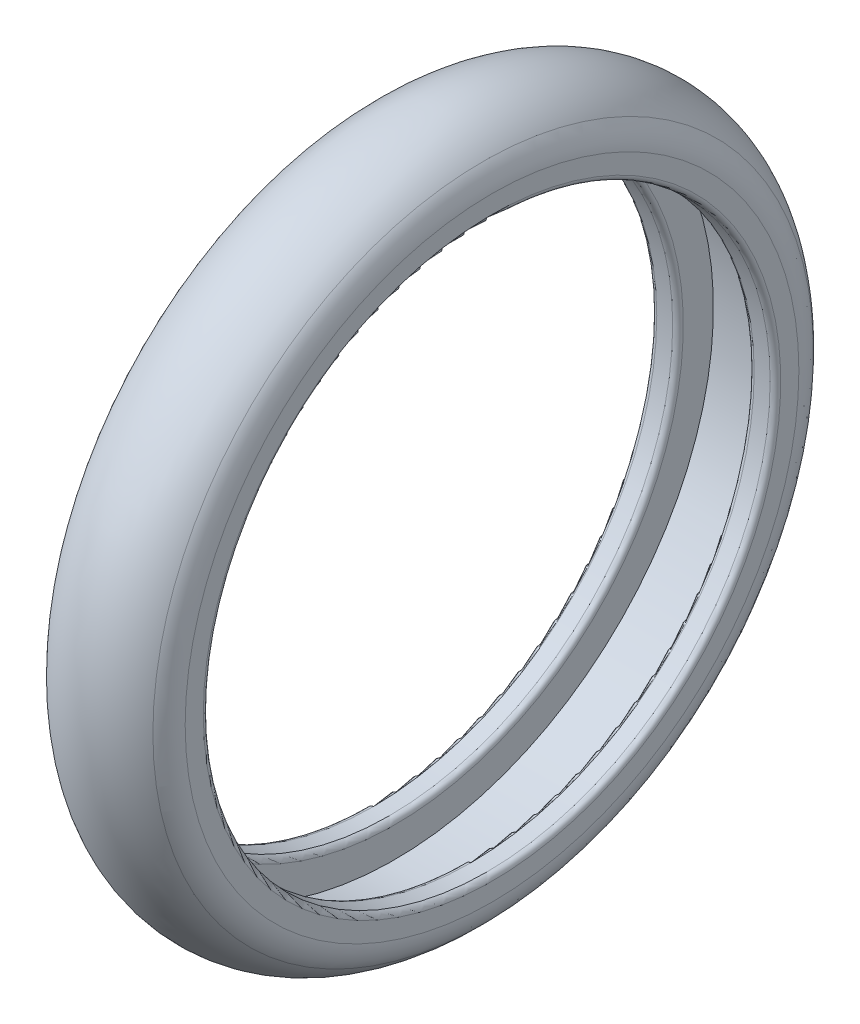
ISO-10303-21;
HEADER;
FILE_DESCRIPTION(('STEP AP214'),'2;1');
FILE_NAME('part.step','',(''),(''),'','','');
FILE_SCHEMA(('AUTOMOTIVE_DESIGN { 1 0 10303 214 1 1 1 1 }'));
ENDSEC;
DATA;
#1=APPLICATION_CONTEXT('core data for automotive mechanical design processes');
#2=APPLICATION_PROTOCOL_DEFINITION('international standard','automotive_design',2000,#1);
#3=PRODUCT_CONTEXT('',#1,'mechanical');
#4=PRODUCT('Part','Part','',(#3));
#5=PRODUCT_RELATED_PRODUCT_CATEGORY('part','',(#4));
#6=PRODUCT_DEFINITION_FORMATION('','',#4);
#7=PRODUCT_DEFINITION_CONTEXT('part definition',#1,'design');
#8=PRODUCT_DEFINITION('design','',#6,#7);
#9=PRODUCT_DEFINITION_SHAPE('','',#8);
#10=(LENGTH_UNIT() NAMED_UNIT(*) SI_UNIT(.MILLI.,.METRE.));
#11=(NAMED_UNIT(*) PLANE_ANGLE_UNIT() SI_UNIT($,.RADIAN.));
#12=(NAMED_UNIT(*) SI_UNIT($,.STERADIAN.) SOLID_ANGLE_UNIT());
#13=UNCERTAINTY_MEASURE_WITH_UNIT(LENGTH_MEASURE(1.E-05),#10,'distance_accuracy_value','');
#14=(GEOMETRIC_REPRESENTATION_CONTEXT(3) GLOBAL_UNCERTAINTY_ASSIGNED_CONTEXT((#13)) GLOBAL_UNIT_ASSIGNED_CONTEXT((#10,
#11,#12)) REPRESENTATION_CONTEXT('',''));
#15=CARTESIAN_POINT('',(0.,0.,0.));
#16=DIRECTION('',(0.,0.,1.));
#17=DIRECTION('',(1.,0.,0.));
#18=AXIS2_PLACEMENT_3D('',#15,#16,#17);
#19=CARTESIAN_POINT('',(0.,0.,0.));
#20=DIRECTION('',(-1.,0.,0.));
#21=DIRECTION('',(0.,0.,1.));
#22=AXIS2_PLACEMENT_3D('',#19,#20,#21);
#23=CYLINDRICAL_SURFACE('',#22,16.);
#24=CARTESIAN_POINT('',(2.3,0.,0.));
#25=DIRECTION('',(1.,0.,0.));
#26=DIRECTION('',(0.,0.,-1.));
#27=AXIS2_PLACEMENT_3D('',#24,#25,#26);
#28=CIRCLE('',#27,16.);
#29=CARTESIAN_POINT('',(2.3,0.,-16.));
#30=VERTEX_POINT('',#29);
#31=EDGE_CURVE('E64',#30,#30,#28,.F.);
#32=ORIENTED_EDGE('',*,*,#31,.T.);
#33=EDGE_LOOP('',(#32));
#34=FACE_BOUND('',#33,.T.);
#35=CARTESIAN_POINT('',(3.2,0.,0.));
#36=DIRECTION('',(-1.,0.,0.));
#37=DIRECTION('',(0.,0.,1.));
#38=AXIS2_PLACEMENT_3D('',#35,#36,#37);
#39=CIRCLE('',#38,16.);
#40=CARTESIAN_POINT('',(3.2,0.,16.));
#41=VERTEX_POINT('',#40);
#42=EDGE_CURVE('E67',#41,#41,#39,.F.);
#43=ORIENTED_EDGE('',*,*,#42,.T.);
#44=EDGE_LOOP('',(#43));
#45=FACE_BOUND('',#44,.T.);
#46=ADVANCED_FACE('F38',(#34,#45),#23,.F.);
#47=CARTESIAN_POINT('',(2.,18.,0.));
#48=DIRECTION('',(1.,0.,0.));
#49=DIRECTION('',(0.,0.,-1.));
#50=AXIS2_PLACEMENT_3D('',#47,#48,#49);
#51=PLANE('',#50);
#52=CARTESIAN_POINT('',(2.,0.,0.));
#53=DIRECTION('',(1.,0.,0.));
#54=DIRECTION('',(0.,0.,-1.));
#55=AXIS2_PLACEMENT_3D('',#52,#53,#54);
#56=CIRCLE('',#55,16.3);
#57=CARTESIAN_POINT('',(2.,0.,-16.3));
#58=VERTEX_POINT('',#57);
#59=EDGE_CURVE('E61',#58,#58,#56,.T.);
#60=ORIENTED_EDGE('',*,*,#59,.T.);
#61=EDGE_LOOP('',(#60));
#62=FACE_BOUND('',#61,.T.);
#63=CARTESIAN_POINT('',(2.,0.,0.));
#64=DIRECTION('',(-1.,0.,0.));
#65=DIRECTION('',(0.,0.,1.));
#66=AXIS2_PLACEMENT_3D('',#63,#64,#65);
#67=CIRCLE('',#66,18.);
#68=CARTESIAN_POINT('',(2.,0.,18.));
#69=VERTEX_POINT('',#68);
#70=EDGE_CURVE('E82',#69,#69,#67,.T.);
#71=ORIENTED_EDGE('',*,*,#70,.T.);
#72=EDGE_LOOP('',(#71));
#73=FACE_BOUND('',#72,.T.);
#74=ADVANCED_FACE('F103',(#62,#73),#51,.F.);
#75=CARTESIAN_POINT('',(0.,0.,0.));
#76=DIRECTION('',(-1.,0.,0.));
#77=DIRECTION('',(0.,0.,1.));
#78=AXIS2_PLACEMENT_3D('',#75,#76,#77);
#79=CYLINDRICAL_SURFACE('',#78,18.);
#80=ORIENTED_EDGE('',*,*,#70,.F.);
#81=EDGE_LOOP('',(#80));
#82=FACE_BOUND('',#81,.T.);
#83=CARTESIAN_POINT('',(-2.,0.,0.));
#84=DIRECTION('',(-1.,0.,0.));
#85=DIRECTION('',(0.,0.,1.));
#86=AXIS2_PLACEMENT_3D('',#83,#84,#85);
#87=CIRCLE('',#86,18.);
#88=CARTESIAN_POINT('',(-2.,0.,18.));
#89=VERTEX_POINT('',#88);
#90=EDGE_CURVE('E85',#89,#89,#87,.T.);
#91=ORIENTED_EDGE('',*,*,#90,.T.);
#92=EDGE_LOOP('',(#91));
#93=FACE_BOUND('',#92,.T.);
#94=ADVANCED_FACE('F89',(#82,#93),#79,.F.);
#95=CARTESIAN_POINT('',(-2.,18.,0.));
#96=DIRECTION('',(-1.,0.,0.));
#97=DIRECTION('',(0.,0.,1.));
#98=AXIS2_PLACEMENT_3D('',#95,#96,#97);
#99=PLANE('',#98);
#100=CARTESIAN_POINT('',(-2.,0.,0.));
#101=DIRECTION('',(-1.,0.,0.));
#102=DIRECTION('',(0.,0.,1.));
#103=AXIS2_PLACEMENT_3D('',#100,#101,#102);
#104=CIRCLE('',#103,16.3);
#105=CARTESIAN_POINT('',(-2.,0.,16.3));
#106=VERTEX_POINT('',#105);
#107=EDGE_CURVE('E58',#106,#106,#104,.T.);
#108=ORIENTED_EDGE('',*,*,#107,.T.);
#109=EDGE_LOOP('',(#108));
#110=FACE_BOUND('',#109,.T.);
#111=ORIENTED_EDGE('',*,*,#90,.F.);
#112=EDGE_LOOP('',(#111));
#113=FACE_BOUND('',#112,.T.);
#114=ADVANCED_FACE('F91',(#110,#113),#99,.F.);
#115=CARTESIAN_POINT('',(0.,0.,0.));
#116=DIRECTION('',(-1.,0.,0.));
#117=DIRECTION('',(0.,0.,1.));
#118=AXIS2_PLACEMENT_3D('',#115,#116,#117);
#119=CYLINDRICAL_SURFACE('',#118,16.);
#120=CARTESIAN_POINT('',(-2.3,0.,0.));
#121=DIRECTION('',(-1.,0.,0.));
#122=DIRECTION('',(0.,0.,1.));
#123=AXIS2_PLACEMENT_3D('',#120,#121,#122);
#124=CIRCLE('',#123,16.);
#125=CARTESIAN_POINT('',(-2.3,0.,16.));
#126=VERTEX_POINT('',#125);
#127=EDGE_CURVE('E49',#126,#126,#124,.F.);
#128=ORIENTED_EDGE('',*,*,#127,.T.);
#129=EDGE_LOOP('',(#128));
#130=FACE_BOUND('',#129,.T.);
#131=CARTESIAN_POINT('',(-3.2,0.,0.));
#132=DIRECTION('',(1.,0.,0.));
#133=DIRECTION('',(0.,0.,-1.));
#134=AXIS2_PLACEMENT_3D('',#131,#132,#133);
#135=CIRCLE('',#134,16.);
#136=CARTESIAN_POINT('',(-3.2,0.,-16.));
#137=VERTEX_POINT('',#136);
#138=EDGE_CURVE('E53',#137,#137,#135,.F.);
#139=ORIENTED_EDGE('',*,*,#138,.T.);
#140=EDGE_LOOP('',(#139));
#141=FACE_BOUND('',#140,.T.);
#142=ADVANCED_FACE('F93',(#130,#141),#119,.F.);
#143=CARTESIAN_POINT('',(-3.5,16.,0.));
#144=DIRECTION('',(1.,0.,0.));
#145=DIRECTION('',(0.,0.,-1.));
#146=AXIS2_PLACEMENT_3D('',#143,#144,#145);
#147=PLANE('',#146);
#148=CARTESIAN_POINT('',(-3.5,0.,0.));
#149=DIRECTION('',(1.,0.,0.));
#150=DIRECTION('',(0.,0.,-1.));
#151=AXIS2_PLACEMENT_3D('',#148,#149,#150);
#152=CIRCLE('',#151,16.3);
#153=CARTESIAN_POINT('',(-3.5,0.,-16.3));
#154=VERTEX_POINT('',#153);
#155=EDGE_CURVE('E45',#154,#154,#152,.T.);
#156=ORIENTED_EDGE('',*,*,#155,.T.);
#157=EDGE_LOOP('',(#156));
#158=FACE_BOUND('',#157,.T.);
#159=CARTESIAN_POINT('',(-3.5,0.,0.));
#160=DIRECTION('',(1.,0.,0.));
#161=DIRECTION('',(0.,0.,-1.));
#162=AXIS2_PLACEMENT_3D('',#159,#160,#161);
#163=CIRCLE('',#162,17.3228756555323);
#164=CARTESIAN_POINT('',(-3.5,0.,-17.3228756555323));
#165=VERTEX_POINT('',#164);
#166=EDGE_CURVE('E79',#165,#165,#163,.F.);
#167=ORIENTED_EDGE('',*,*,#166,.T.);
#168=EDGE_LOOP('',(#167));
#169=FACE_BOUND('',#168,.T.);
#170=ADVANCED_FACE('F100',(#158,#169),#147,.F.);
#171=CARTESIAN_POINT('',(0.,0.,0.));
#172=DIRECTION('',(-1.,0.,0.));
#173=DIRECTION('',(0.,0.,1.));
#174=AXIS2_PLACEMENT_3D('',#171,#172,#173);
#175=TOROIDAL_SURFACE('',#174,16.,4.);
#176=CARTESIAN_POINT('',(-3.00000000000004,0.,0.));
#177=DIRECTION('',(1.,0.,0.));
#178=DIRECTION('',(0.,0.,-1.));
#179=AXIS2_PLACEMENT_3D('',#176,#177,#178);
#180=CIRCLE('',#179,18.6457513110646);
#181=CARTESIAN_POINT('',(-3.00000000000004,0.,-18.6457513110646));
#182=VERTEX_POINT('',#181);
#183=EDGE_CURVE('E73',#182,#182,#180,.T.);
#184=ORIENTED_EDGE('',*,*,#183,.T.);
#185=EDGE_LOOP('',(#184));
#186=FACE_BOUND('',#185,.T.);
#187=CARTESIAN_POINT('',(3.00000000000004,0.,0.));
#188=DIRECTION('',(-1.,0.,0.));
#189=DIRECTION('',(0.,0.,1.));
#190=AXIS2_PLACEMENT_3D('',#187,#188,#189);
#191=CIRCLE('',#190,18.6457513110646);
#192=CARTESIAN_POINT('',(3.00000000000004,0.,18.6457513110646));
#193=VERTEX_POINT('',#192);
#194=EDGE_CURVE('E76',#193,#193,#191,.T.);
#195=ORIENTED_EDGE('',*,*,#194,.T.);
#196=EDGE_LOOP('',(#195));
#197=FACE_BOUND('',#196,.T.);
#198=ADVANCED_FACE('F172',(#186,#197),#175,.T.);
#199=CARTESIAN_POINT('',(3.5,16.,0.));
#200=DIRECTION('',(-1.,0.,0.));
#201=DIRECTION('',(0.,0.,1.));
#202=AXIS2_PLACEMENT_3D('',#199,#200,#201);
#203=PLANE('',#202);
#204=CARTESIAN_POINT('',(3.5,0.,0.));
#205=DIRECTION('',(-1.,0.,0.));
#206=DIRECTION('',(0.,0.,1.));
#207=AXIS2_PLACEMENT_3D('',#204,#205,#206);
#208=CIRCLE('',#207,16.3);
#209=CARTESIAN_POINT('',(3.5,0.,16.3));
#210=VERTEX_POINT('',#209);
#211=EDGE_CURVE('E11',#210,#210,#208,.T.);
#212=ORIENTED_EDGE('',*,*,#211,.T.);
#213=EDGE_LOOP('',(#212));
#214=FACE_BOUND('',#213,.T.);
#215=CARTESIAN_POINT('',(3.5,0.,0.));
#216=DIRECTION('',(-1.,0.,0.));
#217=DIRECTION('',(0.,0.,1.));
#218=AXIS2_PLACEMENT_3D('',#215,#216,#217);
#219=CIRCLE('',#218,17.3228756555323);
#220=CARTESIAN_POINT('',(3.5,0.,17.3228756555323));
#221=VERTEX_POINT('',#220);
#222=EDGE_CURVE('E70',#221,#221,#219,.F.);
#223=ORIENTED_EDGE('',*,*,#222,.T.);
#224=EDGE_LOOP('',(#223));
#225=FACE_BOUND('',#224,.T.);
#226=ADVANCED_FACE('F120',(#214,#225),#203,.F.);
#227=CARTESIAN_POINT('',(-1.5,0.,0.));
#228=DIRECTION('',(1.,0.,0.));
#229=DIRECTION('',(0.,0.,-1.));
#230=AXIS2_PLACEMENT_3D('',#227,#228,#229);
#231=TOROIDAL_SURFACE('',#230,17.3228756555323,2.);
#232=ORIENTED_EDGE('',*,*,#183,.F.);
#233=EDGE_LOOP('',(#232));
#234=FACE_BOUND('',#233,.T.);
#235=ORIENTED_EDGE('',*,*,#166,.F.);
#236=EDGE_LOOP('',(#235));
#237=FACE_BOUND('',#236,.T.);
#238=ADVANCED_FACE('F116',(#234,#237),#231,.T.);
#239=CARTESIAN_POINT('',(1.5,0.,0.));
#240=DIRECTION('',(-1.,0.,0.));
#241=DIRECTION('',(0.,0.,1.));
#242=AXIS2_PLACEMENT_3D('',#239,#240,#241);
#243=TOROIDAL_SURFACE('',#242,17.3228756555323,2.);
#244=ORIENTED_EDGE('',*,*,#222,.F.);
#245=EDGE_LOOP('',(#244));
#246=FACE_BOUND('',#245,.T.);
#247=ORIENTED_EDGE('',*,*,#194,.F.);
#248=EDGE_LOOP('',(#247));
#249=FACE_BOUND('',#248,.T.);
#250=ADVANCED_FACE('F119',(#246,#249),#243,.T.);
#251=CARTESIAN_POINT('',(2.3,0.,0.));
#252=DIRECTION('',(1.,0.,0.));
#253=DIRECTION('',(0.,0.,-1.));
#254=AXIS2_PLACEMENT_3D('',#251,#252,#253);
#255=TOROIDAL_SURFACE('',#254,16.3,0.3);
#256=ORIENTED_EDGE('',*,*,#59,.F.);
#257=EDGE_LOOP('',(#256));
#258=FACE_BOUND('',#257,.T.);
#259=ORIENTED_EDGE('',*,*,#31,.F.);
#260=EDGE_LOOP('',(#259));
#261=FACE_BOUND('',#260,.T.);
#262=ADVANCED_FACE('F124',(#258,#261),#255,.T.);
#263=CARTESIAN_POINT('',(-2.3,0.,0.));
#264=DIRECTION('',(-1.,0.,0.));
#265=DIRECTION('',(0.,0.,1.));
#266=AXIS2_PLACEMENT_3D('',#263,#264,#265);
#267=TOROIDAL_SURFACE('',#266,16.3,0.3);
#268=ORIENTED_EDGE('',*,*,#127,.F.);
#269=EDGE_LOOP('',(#268));
#270=FACE_BOUND('',#269,.T.);
#271=ORIENTED_EDGE('',*,*,#107,.F.);
#272=EDGE_LOOP('',(#271));
#273=FACE_BOUND('',#272,.T.);
#274=ADVANCED_FACE('F128',(#270,#273),#267,.T.);
#275=CARTESIAN_POINT('',(-3.2,0.,0.));
#276=DIRECTION('',(1.,0.,0.));
#277=DIRECTION('',(0.,0.,-1.));
#278=AXIS2_PLACEMENT_3D('',#275,#276,#277);
#279=TOROIDAL_SURFACE('',#278,16.3,0.3);
#280=ORIENTED_EDGE('',*,*,#155,.F.);
#281=EDGE_LOOP('',(#280));
#282=FACE_BOUND('',#281,.T.);
#283=ORIENTED_EDGE('',*,*,#138,.F.);
#284=EDGE_LOOP('',(#283));
#285=FACE_BOUND('',#284,.T.);
#286=ADVANCED_FACE('F131',(#282,#285),#279,.T.);
#287=CARTESIAN_POINT('',(3.2,0.,0.));
#288=DIRECTION('',(-1.,0.,0.));
#289=DIRECTION('',(0.,0.,1.));
#290=AXIS2_PLACEMENT_3D('',#287,#288,#289);
#291=TOROIDAL_SURFACE('',#290,16.3,0.3);
#292=ORIENTED_EDGE('',*,*,#42,.F.);
#293=EDGE_LOOP('',(#292));
#294=FACE_BOUND('',#293,.T.);
#295=ORIENTED_EDGE('',*,*,#211,.F.);
#296=EDGE_LOOP('',(#295));
#297=FACE_BOUND('',#296,.T.);
#298=ADVANCED_FACE('F40',(#294,#297),#291,.T.);
#299=CLOSED_SHELL('',(#46,#74,#94,#114,#142,#170,#198,#226,#238,#250,#262,#274,#286,#298));
#300=MANIFOLD_SOLID_BREP('B2',#299);
#301=ADVANCED_BREP_SHAPE_REPRESENTATION('',(#18,#300),#14);
#302=SHAPE_DEFINITION_REPRESENTATION(#9,#301);
ENDSEC;
END-ISO-10303-21;
